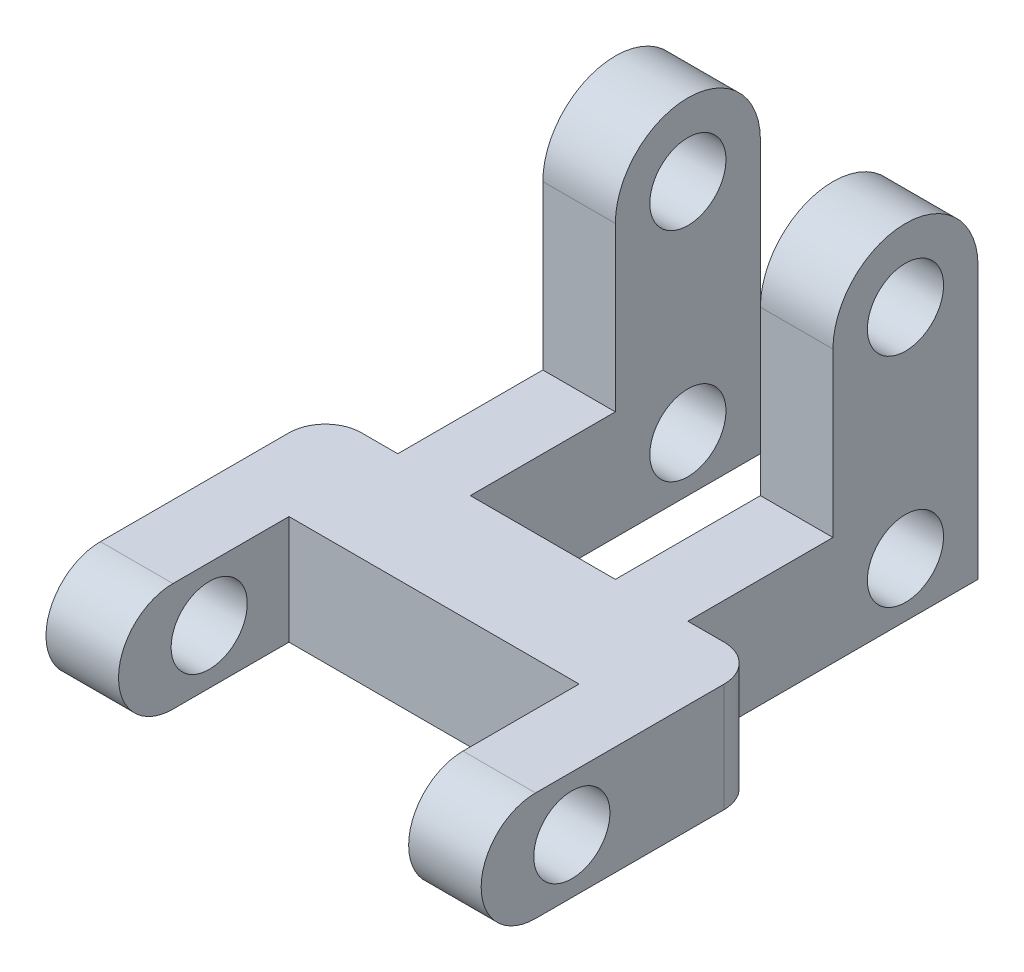
ISO-10303-21;
HEADER;
FILE_DESCRIPTION(('STEP AP214'),'2;1');
FILE_NAME('part.step','',(''),(''),'','','');
FILE_SCHEMA(('AUTOMOTIVE_DESIGN { 1 0 10303 214 1 1 1 1 }'));
ENDSEC;
DATA;
#1=APPLICATION_CONTEXT('core data for automotive mechanical design processes');
#2=APPLICATION_PROTOCOL_DEFINITION('international standard','automotive_design',2000,#1);
#3=PRODUCT_CONTEXT('',#1,'mechanical');
#4=PRODUCT('Part','Part','',(#3));
#5=PRODUCT_RELATED_PRODUCT_CATEGORY('part','',(#4));
#6=PRODUCT_DEFINITION_FORMATION('','',#4);
#7=PRODUCT_DEFINITION_CONTEXT('part definition',#1,'design');
#8=PRODUCT_DEFINITION('design','',#6,#7);
#9=PRODUCT_DEFINITION_SHAPE('','',#8);
#10=(LENGTH_UNIT() NAMED_UNIT(*) SI_UNIT(.MILLI.,.METRE.));
#11=(NAMED_UNIT(*) PLANE_ANGLE_UNIT() SI_UNIT($,.RADIAN.));
#12=(NAMED_UNIT(*) SI_UNIT($,.STERADIAN.) SOLID_ANGLE_UNIT());
#13=UNCERTAINTY_MEASURE_WITH_UNIT(LENGTH_MEASURE(1.E-05),#10,'distance_accuracy_value','');
#14=(GEOMETRIC_REPRESENTATION_CONTEXT(3) GLOBAL_UNCERTAINTY_ASSIGNED_CONTEXT((#13)) GLOBAL_UNIT_ASSIGNED_CONTEXT((#10,
#11,#12)) REPRESENTATION_CONTEXT('',''));
#15=CARTESIAN_POINT('',(0.,0.,0.));
#16=DIRECTION('',(0.,0.,1.));
#17=DIRECTION('',(1.,0.,0.));
#18=AXIS2_PLACEMENT_3D('',#15,#16,#17);
#19=CARTESIAN_POINT('',(-8.,1.49999999999999,-6.));
#20=DIRECTION('',(1.,0.,0.));
#21=DIRECTION('',(0.,1.,0.));
#22=AXIS2_PLACEMENT_3D('',#19,#20,#21);
#23=CYLINDRICAL_SURFACE('',#22,1.05);
#24=CARTESIAN_POINT('',(4.,1.5,-6.));
#25=DIRECTION('',(1.,0.,0.));
#26=DIRECTION('',(0.,1.,0.));
#27=AXIS2_PLACEMENT_3D('',#24,#25,#26);
#28=CIRCLE('',#27,1.05);
#29=CARTESIAN_POINT('',(4.,2.55,-6.));
#30=VERTEX_POINT('',#29);
#31=EDGE_CURVE('E269',#30,#30,#28,.T.);
#32=ORIENTED_EDGE('',*,*,#31,.T.);
#33=EDGE_LOOP('',(#32));
#34=FACE_BOUND('',#33,.T.);
#35=CARTESIAN_POINT('',(2.,1.5,-6.));
#36=DIRECTION('',(1.,0.,0.));
#37=DIRECTION('',(0.,0.,-1.));
#38=AXIS2_PLACEMENT_3D('',#35,#36,#37);
#39=CIRCLE('',#38,1.05);
#40=CARTESIAN_POINT('',(2.,1.5,-7.05));
#41=VERTEX_POINT('',#40);
#42=EDGE_CURVE('E376',#41,#41,#39,.F.);
#43=ORIENTED_EDGE('',*,*,#42,.T.);
#44=EDGE_LOOP('',(#43));
#45=FACE_BOUND('',#44,.T.);
#46=ADVANCED_FACE('F35',(#34,#45),#23,.F.);
#47=CARTESIAN_POINT('',(-6.,3.,0.));
#48=DIRECTION('',(0.,0.,1.));
#49=DIRECTION('',(1.,0.,0.));
#50=AXIS2_PLACEMENT_3D('',#47,#48,#49);
#51=PLANE('',#50);
#52=DIRECTION('',(0.,1.,0.));
#53=VECTOR('',#52,1.);
#54=CARTESIAN_POINT('',(4.,3.,0.));
#55=LINE('',#54,#53);
#56=CARTESIAN_POINT('',(4.,0.,0.));
#57=VERTEX_POINT('',#56);
#58=CARTESIAN_POINT('',(4.,3.,0.));
#59=VERTEX_POINT('',#58);
#60=EDGE_CURVE('E220',#57,#59,#55,.T.);
#61=ORIENTED_EDGE('',*,*,#60,.T.);
#62=DIRECTION('',(-1.,0.,0.));
#63=VECTOR('',#62,1.);
#64=CARTESIAN_POINT('',(-6.,3.,0.));
#65=LINE('',#64,#63);
#66=CARTESIAN_POINT('',(5.,3.,0.));
#67=VERTEX_POINT('',#66);
#68=EDGE_CURVE('E329',#67,#59,#65,.T.);
#69=ORIENTED_EDGE('',*,*,#68,.F.);
#70=DIRECTION('',(0.,-1.,0.));
#71=VECTOR('',#70,1.);
#72=CARTESIAN_POINT('',(5.,3.,0.));
#73=LINE('',#72,#71);
#74=CARTESIAN_POINT('',(5.,0.,0.));
#75=VERTEX_POINT('',#74);
#76=EDGE_CURVE('E359',#67,#75,#73,.T.);
#77=ORIENTED_EDGE('',*,*,#76,.T.);
#78=DIRECTION('',(-1.,0.,0.));
#79=VECTOR('',#78,1.);
#80=CARTESIAN_POINT('',(-6.,0.,0.));
#81=LINE('',#80,#79);
#82=EDGE_CURVE('E345',#75,#57,#81,.T.);
#83=ORIENTED_EDGE('',*,*,#82,.T.);
#84=EDGE_LOOP('',(#61,#69,#77,#83));
#85=FACE_BOUND('',#84,.T.);
#86=ADVANCED_FACE('F404',(#85),#51,.F.);
#87=DIRECTION('',(0.,-1.,0.));
#88=VECTOR('',#87,1.);
#89=CARTESIAN_POINT('',(-4.,0.,0.));
#90=LINE('',#89,#88);
#91=CARTESIAN_POINT('',(-4.,3.,0.));
#92=VERTEX_POINT('',#91);
#93=CARTESIAN_POINT('',(-4.,0.,0.));
#94=VERTEX_POINT('',#93);
#95=EDGE_CURVE('E218',#92,#94,#90,.T.);
#96=ORIENTED_EDGE('',*,*,#95,.T.);
#97=CARTESIAN_POINT('',(-5.,0.,0.));
#98=VERTEX_POINT('',#97);
#99=EDGE_CURVE('E344',#94,#98,#81,.T.);
#100=ORIENTED_EDGE('',*,*,#99,.T.);
#101=DIRECTION('',(0.,-1.,0.));
#102=VECTOR('',#101,1.);
#103=CARTESIAN_POINT('',(-5.,3.,0.));
#104=LINE('',#103,#102);
#105=CARTESIAN_POINT('',(-5.,3.,0.));
#106=VERTEX_POINT('',#105);
#107=EDGE_CURVE('E356',#98,#106,#104,.F.);
#108=ORIENTED_EDGE('',*,*,#107,.T.);
#109=EDGE_CURVE('E328',#92,#106,#65,.T.);
#110=ORIENTED_EDGE('',*,*,#109,.F.);
#111=EDGE_LOOP('',(#96,#100,#108,#110));
#112=FACE_BOUND('',#111,.T.);
#113=ADVANCED_FACE('F410',(#112),#51,.F.);
#114=CARTESIAN_POINT('',(-4.,3.,8.7));
#115=DIRECTION('',(-1.,0.,0.));
#116=DIRECTION('',(0.,0.,1.));
#117=AXIS2_PLACEMENT_3D('',#114,#115,#116);
#118=PLANE('',#117);
#119=CARTESIAN_POINT('',(-4.,1.5,5.2));
#120=DIRECTION('',(-1.,0.,0.));
#121=DIRECTION('',(0.,0.,1.));
#122=AXIS2_PLACEMENT_3D('',#119,#120,#121);
#123=CIRCLE('',#122,1.05);
#124=CARTESIAN_POINT('',(-4.,1.5,6.25));
#125=VERTEX_POINT('',#124);
#126=EDGE_CURVE('E298',#125,#125,#123,.T.);
#127=ORIENTED_EDGE('',*,*,#126,.T.);
#128=EDGE_LOOP('',(#127));
#129=FACE_BOUND('',#128,.T.);
#130=CARTESIAN_POINT('',(-4.,1.5,6.2));
#131=DIRECTION('',(-1.,0.,0.));
#132=DIRECTION('',(0.,0.,1.));
#133=AXIS2_PLACEMENT_3D('',#130,#131,#132);
#134=CIRCLE('',#133,1.5);
#135=CARTESIAN_POINT('',(-4.,0.,6.2));
#136=VERTEX_POINT('',#135);
#137=CARTESIAN_POINT('',(-4.,3.,6.2));
#138=VERTEX_POINT('',#137);
#139=EDGE_CURVE('E314',#136,#138,#134,.T.);
#140=ORIENTED_EDGE('',*,*,#139,.F.);
#141=DIRECTION('',(0.,0.,-1.));
#142=VECTOR('',#141,1.);
#143=CARTESIAN_POINT('',(-4.,0.,8.7));
#144=LINE('',#143,#142);
#145=CARTESIAN_POINT('',(-4.,0.,3.));
#146=VERTEX_POINT('',#145);
#147=EDGE_CURVE('E316',#136,#146,#144,.T.);
#148=ORIENTED_EDGE('',*,*,#147,.T.);
#149=DIRECTION('',(0.,-1.,0.));
#150=VECTOR('',#149,1.);
#151=CARTESIAN_POINT('',(-4.,3.,3.));
#152=LINE('',#151,#150);
#153=CARTESIAN_POINT('',(-4.,3.,3.));
#154=VERTEX_POINT('',#153);
#155=EDGE_CURVE('E350',#154,#146,#152,.T.);
#156=ORIENTED_EDGE('',*,*,#155,.F.);
#157=DIRECTION('',(0.,0.,-1.));
#158=VECTOR('',#157,1.);
#159=CARTESIAN_POINT('',(-4.,3.,8.7));
#160=LINE('',#159,#158);
#161=EDGE_CURVE('E317',#138,#154,#160,.T.);
#162=ORIENTED_EDGE('',*,*,#161,.F.);
#163=EDGE_LOOP('',(#140,#148,#156,#162));
#164=FACE_BOUND('',#163,.T.);
#165=ADVANCED_FACE('F495',(#129,#164),#118,.F.);
#166=CARTESIAN_POINT('',(4.,3.,3.));
#167=DIRECTION('',(1.,0.,0.));
#168=DIRECTION('',(0.,0.,-1.));
#169=AXIS2_PLACEMENT_3D('',#166,#167,#168);
#170=PLANE('',#169);
#171=CARTESIAN_POINT('',(4.,1.5,5.2));
#172=DIRECTION('',(1.,0.,0.));
#173=DIRECTION('',(0.,0.,-1.));
#174=AXIS2_PLACEMENT_3D('',#171,#172,#173);
#175=CIRCLE('',#174,1.05);
#176=CARTESIAN_POINT('',(4.,1.5,4.15));
#177=VERTEX_POINT('',#176);
#178=EDGE_CURVE('E293',#177,#177,#175,.T.);
#179=ORIENTED_EDGE('',*,*,#178,.T.);
#180=EDGE_LOOP('',(#179));
#181=FACE_BOUND('',#180,.T.);
#182=CARTESIAN_POINT('',(4.,1.5,6.2));
#183=DIRECTION('',(1.,0.,0.));
#184=DIRECTION('',(0.,0.,-1.));
#185=AXIS2_PLACEMENT_3D('',#182,#183,#184);
#186=CIRCLE('',#185,1.5);
#187=CARTESIAN_POINT('',(4.,3.,6.2));
#188=VERTEX_POINT('',#187);
#189=CARTESIAN_POINT('',(4.,0.,6.2));
#190=VERTEX_POINT('',#189);
#191=EDGE_CURVE('E310',#188,#190,#186,.T.);
#192=ORIENTED_EDGE('',*,*,#191,.F.);
#193=DIRECTION('',(0.,0.,1.));
#194=VECTOR('',#193,1.);
#195=CARTESIAN_POINT('',(4.,3.,3.));
#196=LINE('',#195,#194);
#197=CARTESIAN_POINT('',(4.,3.,3.));
#198=VERTEX_POINT('',#197);
#199=EDGE_CURVE('E322',#198,#188,#196,.T.);
#200=ORIENTED_EDGE('',*,*,#199,.F.);
#201=DIRECTION('',(0.,-1.,0.));
#202=VECTOR('',#201,1.);
#203=CARTESIAN_POINT('',(4.,3.,3.));
#204=LINE('',#203,#202);
#205=CARTESIAN_POINT('',(4.,0.,3.));
#206=VERTEX_POINT('',#205);
#207=EDGE_CURVE('E334',#198,#206,#204,.T.);
#208=ORIENTED_EDGE('',*,*,#207,.T.);
#209=DIRECTION('',(0.,0.,1.));
#210=VECTOR('',#209,1.);
#211=CARTESIAN_POINT('',(4.,0.,3.));
#212=LINE('',#211,#210);
#213=EDGE_CURVE('E338',#206,#190,#212,.T.);
#214=ORIENTED_EDGE('',*,*,#213,.T.);
#215=EDGE_LOOP('',(#192,#200,#208,#214));
#216=FACE_BOUND('',#215,.T.);
#217=ADVANCED_FACE('F504',(#181,#216),#170,.F.);
#218=CARTESIAN_POINT('',(6.,3.,8.7));
#219=DIRECTION('',(-1.,0.,0.));
#220=DIRECTION('',(0.,0.,1.));
#221=AXIS2_PLACEMENT_3D('',#218,#219,#220);
#222=PLANE('',#221);
#223=CARTESIAN_POINT('',(6.,1.5,5.2));
#224=DIRECTION('',(-1.,0.,0.));
#225=DIRECTION('',(0.,0.,1.));
#226=AXIS2_PLACEMENT_3D('',#223,#224,#225);
#227=CIRCLE('',#226,1.05);
#228=CARTESIAN_POINT('',(6.,1.5,6.25));
#229=VERTEX_POINT('',#228);
#230=EDGE_CURVE('E290',#229,#229,#227,.T.);
#231=ORIENTED_EDGE('',*,*,#230,.T.);
#232=EDGE_LOOP('',(#231));
#233=FACE_BOUND('',#232,.T.);
#234=DIRECTION('',(0.,0.,-1.));
#235=VECTOR('',#234,1.);
#236=CARTESIAN_POINT('',(6.,0.,8.7));
#237=LINE('',#236,#235);
#238=CARTESIAN_POINT('',(6.00000000000001,0.,6.2));
#239=VERTEX_POINT('',#238);
#240=CARTESIAN_POINT('',(6.,0.,1.));
#241=VERTEX_POINT('',#240);
#242=EDGE_CURVE('E341',#239,#241,#237,.T.);
#243=ORIENTED_EDGE('',*,*,#242,.T.);
#244=DIRECTION('',(0.,-1.,0.));
#245=VECTOR('',#244,1.);
#246=CARTESIAN_POINT('',(6.,3.,1.));
#247=LINE('',#246,#245);
#248=CARTESIAN_POINT('',(6.,3.,1.));
#249=VERTEX_POINT('',#248);
#250=EDGE_CURVE('E367',#241,#249,#247,.F.);
#251=ORIENTED_EDGE('',*,*,#250,.T.);
#252=DIRECTION('',(0.,0.,-1.));
#253=VECTOR('',#252,1.);
#254=CARTESIAN_POINT('',(6.,3.,8.7));
#255=LINE('',#254,#253);
#256=CARTESIAN_POINT('',(6.00000000000001,3.,6.2));
#257=VERTEX_POINT('',#256);
#258=EDGE_CURVE('E325',#257,#249,#255,.T.);
#259=ORIENTED_EDGE('',*,*,#258,.F.);
#260=CARTESIAN_POINT('',(6.00000000000001,1.5,6.2));
#261=DIRECTION('',(-1.,0.,0.));
#262=DIRECTION('',(0.,0.,1.));
#263=AXIS2_PLACEMENT_3D('',#260,#261,#262);
#264=CIRCLE('',#263,1.5);
#265=EDGE_CURVE('E302',#239,#257,#264,.T.);
#266=ORIENTED_EDGE('',*,*,#265,.F.);
#267=EDGE_LOOP('',(#243,#251,#259,#266));
#268=FACE_BOUND('',#267,.T.);
#269=ADVANCED_FACE('F511',(#233,#268),#222,.F.);
#270=CARTESIAN_POINT('',(-6.,3.,0.));
#271=DIRECTION('',(1.,0.,0.));
#272=DIRECTION('',(0.,0.,-1.));
#273=AXIS2_PLACEMENT_3D('',#270,#271,#272);
#274=PLANE('',#273);
#275=CARTESIAN_POINT('',(-6.,1.5,5.2));
#276=DIRECTION('',(-1.,0.,0.));
#277=DIRECTION('',(0.,0.,1.));
#278=AXIS2_PLACEMENT_3D('',#275,#276,#277);
#279=CIRCLE('',#278,1.05);
#280=CARTESIAN_POINT('',(-6.,1.5,6.25));
#281=VERTEX_POINT('',#280);
#282=EDGE_CURVE('E289',#281,#281,#279,.T.);
#283=ORIENTED_EDGE('',*,*,#282,.F.);
#284=EDGE_LOOP('',(#283));
#285=FACE_BOUND('',#284,.T.);
#286=DIRECTION('',(0.,0.,1.));
#287=VECTOR('',#286,1.);
#288=CARTESIAN_POINT('',(-6.,3.,0.));
#289=LINE('',#288,#287);
#290=CARTESIAN_POINT('',(-6.,3.,1.));
#291=VERTEX_POINT('',#290);
#292=CARTESIAN_POINT('',(-6.,3.,6.2));
#293=VERTEX_POINT('',#292);
#294=EDGE_CURVE('E332',#291,#293,#289,.T.);
#295=ORIENTED_EDGE('',*,*,#294,.F.);
#296=DIRECTION('',(0.,-1.,0.));
#297=VECTOR('',#296,1.);
#298=CARTESIAN_POINT('',(-6.,3.,1.));
#299=LINE('',#298,#297);
#300=CARTESIAN_POINT('',(-6.,0.,1.));
#301=VERTEX_POINT('',#300);
#302=EDGE_CURVE('E373',#291,#301,#299,.T.);
#303=ORIENTED_EDGE('',*,*,#302,.T.);
#304=DIRECTION('',(0.,0.,1.));
#305=VECTOR('',#304,1.);
#306=CARTESIAN_POINT('',(-6.,0.,0.));
#307=LINE('',#306,#305);
#308=CARTESIAN_POINT('',(-6.,0.,6.2));
#309=VERTEX_POINT('',#308);
#310=EDGE_CURVE('E320',#301,#309,#307,.T.);
#311=ORIENTED_EDGE('',*,*,#310,.T.);
#312=CARTESIAN_POINT('',(-6.,1.5,6.2));
#313=DIRECTION('',(-1.,0.,0.));
#314=DIRECTION('',(0.,0.,1.));
#315=AXIS2_PLACEMENT_3D('',#312,#313,#314);
#316=CIRCLE('',#315,1.5);
#317=EDGE_CURVE('E301',#309,#293,#316,.T.);
#318=ORIENTED_EDGE('',*,*,#317,.T.);
#319=EDGE_LOOP('',(#295,#303,#311,#318));
#320=FACE_BOUND('',#319,.T.);
#321=ADVANCED_FACE('F485',(#285,#320),#274,.F.);
#322=CARTESIAN_POINT('',(0.,3.,0.));
#323=DIRECTION('',(0.,-1.,0.));
#324=DIRECTION('',(0.,0.,-1.));
#325=AXIS2_PLACEMENT_3D('',#322,#323,#324);
#326=PLANE('',#325);
#327=DIRECTION('',(1.,0.,0.));
#328=VECTOR('',#327,1.);
#329=CARTESIAN_POINT('',(2.,3.,-4.));
#330=LINE('',#329,#328);
#331=CARTESIAN_POINT('',(2.,3.,-4.));
#332=VERTEX_POINT('',#331);
#333=CARTESIAN_POINT('',(4.,3.,-4.));
#334=VERTEX_POINT('',#333);
#335=EDGE_CURVE('E235',#332,#334,#330,.T.);
#336=ORIENTED_EDGE('',*,*,#335,.F.);
#337=DIRECTION('',(0.,0.,-1.));
#338=VECTOR('',#337,1.);
#339=CARTESIAN_POINT('',(2.,3.,-6.));
#340=LINE('',#339,#338);
#341=CARTESIAN_POINT('',(2.,3.,0.));
#342=VERTEX_POINT('',#341);
#343=EDGE_CURVE('E199',#342,#332,#340,.T.);
#344=ORIENTED_EDGE('',*,*,#343,.F.);
#345=DIRECTION('',(1.,0.,0.));
#346=VECTOR('',#345,1.);
#347=CARTESIAN_POINT('',(-2.,3.,0.));
#348=LINE('',#347,#346);
#349=CARTESIAN_POINT('',(-2.,3.,0.));
#350=VERTEX_POINT('',#349);
#351=EDGE_CURVE('E194',#350,#342,#348,.T.);
#352=ORIENTED_EDGE('',*,*,#351,.F.);
#353=DIRECTION('',(0.,0.,1.));
#354=VECTOR('',#353,1.);
#355=CARTESIAN_POINT('',(-2.,3.,-6.));
#356=LINE('',#355,#354);
#357=CARTESIAN_POINT('',(-2.,3.,-4.));
#358=VERTEX_POINT('',#357);
#359=EDGE_CURVE('E202',#358,#350,#356,.T.);
#360=ORIENTED_EDGE('',*,*,#359,.F.);
#361=DIRECTION('',(-1.,0.,0.));
#362=VECTOR('',#361,1.);
#363=CARTESIAN_POINT('',(-2.,3.,-4.));
#364=LINE('',#363,#362);
#365=CARTESIAN_POINT('',(-4.,3.,-4.));
#366=VERTEX_POINT('',#365);
#367=EDGE_CURVE('E249',#358,#366,#364,.T.);
#368=ORIENTED_EDGE('',*,*,#367,.T.);
#369=DIRECTION('',(0.,0.,1.));
#370=VECTOR('',#369,1.);
#371=CARTESIAN_POINT('',(-4.,3.,-8.));
#372=LINE('',#371,#370);
#373=EDGE_CURVE('E286',#366,#92,#372,.T.);
#374=ORIENTED_EDGE('',*,*,#373,.T.);
#375=ORIENTED_EDGE('',*,*,#109,.T.);
#376=CARTESIAN_POINT('',(-5.,3.,1.));
#377=DIRECTION('',(0.,-1.,0.));
#378=DIRECTION('',(0.,0.,-1.));
#379=AXIS2_PLACEMENT_3D('',#376,#377,#378);
#380=CIRCLE('',#379,1.);
#381=EDGE_CURVE('E369',#106,#291,#380,.F.);
#382=ORIENTED_EDGE('',*,*,#381,.T.);
#383=ORIENTED_EDGE('',*,*,#294,.T.);
#384=DIRECTION('',(-1.,0.,0.));
#385=VECTOR('',#384,1.);
#386=CARTESIAN_POINT('',(6.00000000000001,3.,6.2));
#387=LINE('',#386,#385);
#388=EDGE_CURVE('E304',#138,#293,#387,.T.);
#389=ORIENTED_EDGE('',*,*,#388,.F.);
#390=ORIENTED_EDGE('',*,*,#161,.T.);
#391=DIRECTION('',(1.,0.,0.));
#392=VECTOR('',#391,1.);
#393=CARTESIAN_POINT('',(-4.,3.,3.));
#394=LINE('',#393,#392);
#395=EDGE_CURVE('E319',#154,#198,#394,.T.);
#396=ORIENTED_EDGE('',*,*,#395,.T.);
#397=ORIENTED_EDGE('',*,*,#199,.T.);
#398=EDGE_CURVE('E311',#257,#188,#387,.T.);
#399=ORIENTED_EDGE('',*,*,#398,.F.);
#400=ORIENTED_EDGE('',*,*,#258,.T.);
#401=CARTESIAN_POINT('',(5.,3.,1.));
#402=DIRECTION('',(0.,-1.,0.));
#403=DIRECTION('',(0.,0.,-1.));
#404=AXIS2_PLACEMENT_3D('',#401,#402,#403);
#405=CIRCLE('',#404,1.);
#406=EDGE_CURVE('E371',#249,#67,#405,.F.);
#407=ORIENTED_EDGE('',*,*,#406,.T.);
#408=ORIENTED_EDGE('',*,*,#68,.T.);
#409=DIRECTION('',(0.,0.,1.));
#410=VECTOR('',#409,1.);
#411=CARTESIAN_POINT('',(4.,3.,-8.));
#412=LINE('',#411,#410);
#413=EDGE_CURVE('E284',#334,#59,#412,.T.);
#414=ORIENTED_EDGE('',*,*,#413,.F.);
#415=EDGE_LOOP('',(#336,#344,#352,#360,#368,#374,#375,#382,#383,#389,#390,#396,#397,#399,#400,
#407,#408,#414));
#416=FACE_BOUND('',#415,.T.);
#417=ADVANCED_FACE('F213',(#416),#326,.F.);
#418=CARTESIAN_POINT('',(0.,0.,0.));
#419=DIRECTION('',(0.,-1.,0.));
#420=DIRECTION('',(0.,0.,-1.));
#421=AXIS2_PLACEMENT_3D('',#418,#419,#420);
#422=PLANE('',#421);
#423=DIRECTION('',(-1.,0.,0.));
#424=VECTOR('',#423,1.);
#425=CARTESIAN_POINT('',(0.,0.,0.));
#426=LINE('',#425,#424);
#427=CARTESIAN_POINT('',(2.,0.,0.));
#428=VERTEX_POINT('',#427);
#429=CARTESIAN_POINT('',(-2.,0.,0.));
#430=VERTEX_POINT('',#429);
#431=EDGE_CURVE('E12',#428,#430,#426,.T.);
#432=ORIENTED_EDGE('',*,*,#431,.F.);
#433=DIRECTION('',(0.,0.,-1.));
#434=VECTOR('',#433,1.);
#435=CARTESIAN_POINT('',(2.,0.,-8.));
#436=LINE('',#435,#434);
#437=CARTESIAN_POINT('',(2.,0.,-8.));
#438=VERTEX_POINT('',#437);
#439=EDGE_CURVE('E263',#428,#438,#436,.T.);
#440=ORIENTED_EDGE('',*,*,#439,.T.);
#441=DIRECTION('',(-1.,0.,0.));
#442=VECTOR('',#441,1.);
#443=CARTESIAN_POINT('',(-4.,0.,-8.));
#444=LINE('',#443,#442);
#445=CARTESIAN_POINT('',(4.,0.,-8.));
#446=VERTEX_POINT('',#445);
#447=EDGE_CURVE('E276',#446,#438,#444,.T.);
#448=ORIENTED_EDGE('',*,*,#447,.F.);
#449=DIRECTION('',(0.,0.,1.));
#450=VECTOR('',#449,1.);
#451=CARTESIAN_POINT('',(4.,0.,-8.));
#452=LINE('',#451,#450);
#453=EDGE_CURVE('E59',#446,#57,#452,.T.);
#454=ORIENTED_EDGE('',*,*,#453,.T.);
#455=ORIENTED_EDGE('',*,*,#82,.F.);
#456=CARTESIAN_POINT('',(5.,0.,1.));
#457=DIRECTION('',(0.,-1.,0.));
#458=DIRECTION('',(0.,0.,-1.));
#459=AXIS2_PLACEMENT_3D('',#456,#457,#458);
#460=CIRCLE('',#459,1.);
#461=EDGE_CURVE('E365',#75,#241,#460,.T.);
#462=ORIENTED_EDGE('',*,*,#461,.T.);
#463=ORIENTED_EDGE('',*,*,#242,.F.);
#464=DIRECTION('',(-1.,0.,0.));
#465=VECTOR('',#464,1.);
#466=CARTESIAN_POINT('',(6.00000000000001,0.,6.2));
#467=LINE('',#466,#465);
#468=EDGE_CURVE('E307',#239,#190,#467,.T.);
#469=ORIENTED_EDGE('',*,*,#468,.T.);
#470=ORIENTED_EDGE('',*,*,#213,.F.);
#471=DIRECTION('',(1.,0.,0.));
#472=VECTOR('',#471,1.);
#473=CARTESIAN_POINT('',(-4.,0.,3.));
#474=LINE('',#473,#472);
#475=EDGE_CURVE('E336',#146,#206,#474,.T.);
#476=ORIENTED_EDGE('',*,*,#475,.F.);
#477=ORIENTED_EDGE('',*,*,#147,.F.);
#478=DIRECTION('',(-1.,0.,0.));
#479=VECTOR('',#478,1.);
#480=CARTESIAN_POINT('',(6.00000000000001,0.,6.2));
#481=LINE('',#480,#479);
#482=EDGE_CURVE('E353',#136,#309,#481,.T.);
#483=ORIENTED_EDGE('',*,*,#482,.T.);
#484=ORIENTED_EDGE('',*,*,#310,.F.);
#485=CARTESIAN_POINT('',(-5.,0.,1.));
#486=DIRECTION('',(0.,-1.,0.));
#487=DIRECTION('',(0.,0.,-1.));
#488=AXIS2_PLACEMENT_3D('',#485,#486,#487);
#489=CIRCLE('',#488,1.);
#490=EDGE_CURVE('E362',#301,#98,#489,.T.);
#491=ORIENTED_EDGE('',*,*,#490,.T.);
#492=ORIENTED_EDGE('',*,*,#99,.F.);
#493=DIRECTION('',(0.,0.,1.));
#494=VECTOR('',#493,1.);
#495=CARTESIAN_POINT('',(-4.,0.,-8.));
#496=LINE('',#495,#494);
#497=CARTESIAN_POINT('',(-4.,0.,-8.));
#498=VERTEX_POINT('',#497);
#499=EDGE_CURVE('E51',#498,#94,#496,.T.);
#500=ORIENTED_EDGE('',*,*,#499,.F.);
#501=CARTESIAN_POINT('',(-2.,0.,-8.));
#502=VERTEX_POINT('',#501);
#503=EDGE_CURVE('E275',#502,#498,#444,.T.);
#504=ORIENTED_EDGE('',*,*,#503,.F.);
#505=DIRECTION('',(0.,0.,1.));
#506=VECTOR('',#505,1.);
#507=CARTESIAN_POINT('',(-2.,0.,-8.));
#508=LINE('',#507,#506);
#509=EDGE_CURVE('E267',#502,#430,#508,.T.);
#510=ORIENTED_EDGE('',*,*,#509,.T.);
#511=EDGE_LOOP('',(#432,#440,#448,#454,#455,#462,#463,#469,#470,#476,#477,#483,#484,#491,#492,
#500,#504,#510));
#512=FACE_BOUND('',#511,.T.);
#513=ADVANCED_FACE('F466',(#512),#422,.T.);
#514=CARTESIAN_POINT('',(-4.,3.,3.));
#515=DIRECTION('',(0.,0.,-1.));
#516=DIRECTION('',(-1.,0.,0.));
#517=AXIS2_PLACEMENT_3D('',#514,#515,#516);
#518=PLANE('',#517);
#519=ORIENTED_EDGE('',*,*,#475,.T.);
#520=ORIENTED_EDGE('',*,*,#207,.F.);
#521=ORIENTED_EDGE('',*,*,#395,.F.);
#522=ORIENTED_EDGE('',*,*,#155,.T.);
#523=EDGE_LOOP('',(#519,#520,#521,#522));
#524=FACE_BOUND('',#523,.T.);
#525=ADVANCED_FACE('F500',(#524),#518,.F.);
#526=CARTESIAN_POINT('',(6.00000000000001,1.5,6.2));
#527=DIRECTION('',(-1.,0.,0.));
#528=DIRECTION('',(0.,0.,1.));
#529=AXIS2_PLACEMENT_3D('',#526,#527,#528);
#530=CYLINDRICAL_SURFACE('',#529,1.5);
#531=ORIENTED_EDGE('',*,*,#139,.T.);
#532=ORIENTED_EDGE('',*,*,#388,.T.);
#533=ORIENTED_EDGE('',*,*,#317,.F.);
#534=ORIENTED_EDGE('',*,*,#482,.F.);
#535=EDGE_LOOP('',(#531,#532,#533,#534));
#536=FACE_BOUND('',#535,.T.);
#537=ADVANCED_FACE('F488',(#536),#530,.T.);
#538=ORIENTED_EDGE('',*,*,#191,.T.);
#539=ORIENTED_EDGE('',*,*,#468,.F.);
#540=ORIENTED_EDGE('',*,*,#265,.T.);
#541=ORIENTED_EDGE('',*,*,#398,.T.);
#542=EDGE_LOOP('',(#538,#539,#540,#541));
#543=FACE_BOUND('',#542,.T.);
#544=ADVANCED_FACE('F535',(#543),#530,.T.);
#545=CARTESIAN_POINT('',(6.,1.5,5.2));
#546=DIRECTION('',(-1.,0.,0.));
#547=DIRECTION('',(0.,0.,1.));
#548=AXIS2_PLACEMENT_3D('',#545,#546,#547);
#549=CYLINDRICAL_SURFACE('',#548,1.05);
#550=ORIENTED_EDGE('',*,*,#282,.T.);
#551=EDGE_LOOP('',(#550));
#552=FACE_BOUND('',#551,.T.);
#553=ORIENTED_EDGE('',*,*,#126,.F.);
#554=EDGE_LOOP('',(#553));
#555=FACE_BOUND('',#554,.T.);
#556=ADVANCED_FACE('F531',(#552,#555),#549,.F.);
#557=ORIENTED_EDGE('',*,*,#230,.F.);
#558=EDGE_LOOP('',(#557));
#559=FACE_BOUND('',#558,.T.);
#560=ORIENTED_EDGE('',*,*,#178,.F.);
#561=EDGE_LOOP('',(#560));
#562=FACE_BOUND('',#561,.T.);
#563=ADVANCED_FACE('F534',(#559,#562),#549,.F.);
#564=CARTESIAN_POINT('',(5.,3.,1.));
#565=DIRECTION('',(0.,-1.,0.));
#566=DIRECTION('',(0.,0.,-1.));
#567=AXIS2_PLACEMENT_3D('',#564,#565,#566);
#568=CYLINDRICAL_SURFACE('',#567,1.);
#569=ORIENTED_EDGE('',*,*,#406,.F.);
#570=ORIENTED_EDGE('',*,*,#250,.F.);
#571=ORIENTED_EDGE('',*,*,#461,.F.);
#572=ORIENTED_EDGE('',*,*,#76,.F.);
#573=EDGE_LOOP('',(#569,#570,#571,#572));
#574=FACE_BOUND('',#573,.T.);
#575=ADVANCED_FACE('F515',(#574),#568,.T.);
#576=CARTESIAN_POINT('',(-5.,3.,1.));
#577=DIRECTION('',(0.,-1.,0.));
#578=DIRECTION('',(0.,0.,-1.));
#579=AXIS2_PLACEMENT_3D('',#576,#577,#578);
#580=CYLINDRICAL_SURFACE('',#579,1.);
#581=ORIENTED_EDGE('',*,*,#381,.F.);
#582=ORIENTED_EDGE('',*,*,#107,.F.);
#583=ORIENTED_EDGE('',*,*,#490,.F.);
#584=ORIENTED_EDGE('',*,*,#302,.F.);
#585=EDGE_LOOP('',(#581,#582,#583,#584));
#586=FACE_BOUND('',#585,.T.);
#587=ADVANCED_FACE('F37',(#586),#580,.T.);
#588=CARTESIAN_POINT('',(2.,7.5,-6.));
#589=DIRECTION('',(1.,0.,0.));
#590=DIRECTION('',(0.,0.,-1.));
#591=AXIS2_PLACEMENT_3D('',#588,#589,#590);
#592=CYLINDRICAL_SURFACE('',#591,2.);
#593=CARTESIAN_POINT('',(4.,7.5,-6.));
#594=DIRECTION('',(-1.,0.,0.));
#595=DIRECTION('',(0.,0.,1.));
#596=AXIS2_PLACEMENT_3D('',#593,#594,#595);
#597=CIRCLE('',#596,2.);
#598=CARTESIAN_POINT('',(4.,7.5,-4.));
#599=VERTEX_POINT('',#598);
#600=CARTESIAN_POINT('',(4.,7.5,-8.));
#601=VERTEX_POINT('',#600);
#602=EDGE_CURVE('E223',#599,#601,#597,.T.);
#603=ORIENTED_EDGE('',*,*,#602,.T.);
#604=DIRECTION('',(1.,0.,0.));
#605=VECTOR('',#604,1.);
#606=CARTESIAN_POINT('',(2.,7.5,-8.));
#607=LINE('',#606,#605);
#608=CARTESIAN_POINT('',(2.,7.5,-8.));
#609=VERTEX_POINT('',#608);
#610=EDGE_CURVE('E231',#609,#601,#607,.T.);
#611=ORIENTED_EDGE('',*,*,#610,.F.);
#612=CARTESIAN_POINT('',(2.,7.5,-6.));
#613=DIRECTION('',(-1.,0.,0.));
#614=DIRECTION('',(0.,0.,1.));
#615=AXIS2_PLACEMENT_3D('',#612,#613,#614);
#616=CIRCLE('',#615,2.);
#617=CARTESIAN_POINT('',(2.,7.5,-4.));
#618=VERTEX_POINT('',#617);
#619=EDGE_CURVE('E225',#618,#609,#616,.T.);
#620=ORIENTED_EDGE('',*,*,#619,.F.);
#621=DIRECTION('',(1.,0.,0.));
#622=VECTOR('',#621,1.);
#623=CARTESIAN_POINT('',(2.,7.5,-4.));
#624=LINE('',#623,#622);
#625=EDGE_CURVE('E239',#618,#599,#624,.T.);
#626=ORIENTED_EDGE('',*,*,#625,.T.);
#627=EDGE_LOOP('',(#603,#611,#620,#626));
#628=FACE_BOUND('',#627,.T.);
#629=ADVANCED_FACE('F397',(#628),#592,.T.);
#630=CARTESIAN_POINT('',(0.,0.,-8.));
#631=DIRECTION('',(0.,0.,1.));
#632=DIRECTION('',(1.,0.,0.));
#633=AXIS2_PLACEMENT_3D('',#630,#631,#632);
#634=PLANE('',#633);
#635=ORIENTED_EDGE('',*,*,#447,.T.);
#636=DIRECTION('',(0.,1.,0.));
#637=VECTOR('',#636,1.);
#638=CARTESIAN_POINT('',(2.,-5.,-8.));
#639=LINE('',#638,#637);
#640=EDGE_CURVE('E257',#438,#609,#639,.T.);
#641=ORIENTED_EDGE('',*,*,#640,.T.);
#642=ORIENTED_EDGE('',*,*,#610,.T.);
#643=DIRECTION('',(0.,-1.,0.));
#644=VECTOR('',#643,1.);
#645=CARTESIAN_POINT('',(4.,0.,-8.));
#646=LINE('',#645,#644);
#647=EDGE_CURVE('E281',#601,#446,#646,.T.);
#648=ORIENTED_EDGE('',*,*,#647,.T.);
#649=EDGE_LOOP('',(#635,#641,#642,#648));
#650=FACE_BOUND('',#649,.T.);
#651=ADVANCED_FACE('F387',(#650),#634,.F.);
#652=CARTESIAN_POINT('',(-2.,-5.,-8.));
#653=DIRECTION('',(-1.,0.,0.));
#654=DIRECTION('',(0.,0.,1.));
#655=AXIS2_PLACEMENT_3D('',#652,#653,#654);
#656=PLANE('',#655);
#657=CARTESIAN_POINT('',(-2.,7.5,-6.));
#658=DIRECTION('',(-1.,0.,0.));
#659=DIRECTION('',(0.,0.,1.));
#660=AXIS2_PLACEMENT_3D('',#657,#658,#659);
#661=CIRCLE('',#660,1.05);
#662=CARTESIAN_POINT('',(-2.,7.5,-4.95));
#663=VERTEX_POINT('',#662);
#664=EDGE_CURVE('E210',#663,#663,#661,.T.);
#665=ORIENTED_EDGE('',*,*,#664,.T.);
#666=EDGE_LOOP('',(#665));
#667=FACE_BOUND('',#666,.T.);
#668=CARTESIAN_POINT('',(-2.,1.5,-6.));
#669=DIRECTION('',(-1.,0.,0.));
#670=DIRECTION('',(0.,0.,1.));
#671=AXIS2_PLACEMENT_3D('',#668,#669,#670);
#672=CIRCLE('',#671,1.05);
#673=CARTESIAN_POINT('',(-2.,1.5,-4.95));
#674=VERTEX_POINT('',#673);
#675=EDGE_CURVE('E44',#674,#674,#672,.F.);
#676=ORIENTED_EDGE('',*,*,#675,.F.);
#677=EDGE_LOOP('',(#676));
#678=FACE_BOUND('',#677,.T.);
#679=DIRECTION('',(0.,1.,0.));
#680=VECTOR('',#679,1.);
#681=CARTESIAN_POINT('',(-2.,3.,-4.));
#682=LINE('',#681,#680);
#683=CARTESIAN_POINT('',(-2.,7.5,-4.));
#684=VERTEX_POINT('',#683);
#685=EDGE_CURVE('E206',#358,#684,#682,.T.);
#686=ORIENTED_EDGE('',*,*,#685,.F.);
#687=ORIENTED_EDGE('',*,*,#359,.T.);
#688=DIRECTION('',(0.,1.,0.));
#689=VECTOR('',#688,1.);
#690=CARTESIAN_POINT('',(-2.,-7.,0.));
#691=LINE('',#690,#689);
#692=EDGE_CURVE('E189',#430,#350,#691,.T.);
#693=ORIENTED_EDGE('',*,*,#692,.F.);
#694=ORIENTED_EDGE('',*,*,#509,.F.);
#695=DIRECTION('',(0.,1.,0.));
#696=VECTOR('',#695,1.);
#697=CARTESIAN_POINT('',(-2.,-5.,-8.));
#698=LINE('',#697,#696);
#699=CARTESIAN_POINT('',(-2.,7.5,-8.));
#700=VERTEX_POINT('',#699);
#701=EDGE_CURVE('E261',#502,#700,#698,.T.);
#702=ORIENTED_EDGE('',*,*,#701,.T.);
#703=CARTESIAN_POINT('',(-2.,7.5,-6.));
#704=DIRECTION('',(-1.,0.,0.));
#705=DIRECTION('',(0.,0.,1.));
#706=AXIS2_PLACEMENT_3D('',#703,#704,#705);
#707=CIRCLE('',#706,2.);
#708=EDGE_CURVE('E245',#684,#700,#707,.T.);
#709=ORIENTED_EDGE('',*,*,#708,.F.);
#710=EDGE_LOOP('',(#686,#687,#693,#694,#702,#709));
#711=FACE_BOUND('',#710,.T.);
#712=ADVANCED_FACE('F203',(#667,#678,#711),#656,.F.);
#713=CARTESIAN_POINT('',(2.,-5.,-8.));
#714=DIRECTION('',(1.,0.,0.));
#715=DIRECTION('',(0.,0.,-1.));
#716=AXIS2_PLACEMENT_3D('',#713,#714,#715);
#717=PLANE('',#716);
#718=CARTESIAN_POINT('',(2.,7.5,-6.));
#719=DIRECTION('',(1.,0.,0.));
#720=DIRECTION('',(0.,0.,-1.));
#721=AXIS2_PLACEMENT_3D('',#718,#719,#720);
#722=CIRCLE('',#721,1.05);
#723=CARTESIAN_POINT('',(2.,7.5,-7.05));
#724=VERTEX_POINT('',#723);
#725=EDGE_CURVE('E453',#724,#724,#722,.T.);
#726=ORIENTED_EDGE('',*,*,#725,.T.);
#727=EDGE_LOOP('',(#726));
#728=FACE_BOUND('',#727,.T.);
#729=ORIENTED_EDGE('',*,*,#42,.F.);
#730=EDGE_LOOP('',(#729));
#731=FACE_BOUND('',#730,.T.);
#732=ORIENTED_EDGE('',*,*,#439,.F.);
#733=DIRECTION('',(0.,1.,0.));
#734=VECTOR('',#733,1.);
#735=CARTESIAN_POINT('',(2.,-7.,0.));
#736=LINE('',#735,#734);
#737=EDGE_CURVE('E198',#428,#342,#736,.T.);
#738=ORIENTED_EDGE('',*,*,#737,.T.);
#739=ORIENTED_EDGE('',*,*,#343,.T.);
#740=DIRECTION('',(0.,1.,0.));
#741=VECTOR('',#740,1.);
#742=CARTESIAN_POINT('',(2.,3.,-4.));
#743=LINE('',#742,#741);
#744=EDGE_CURVE('E228',#332,#618,#743,.T.);
#745=ORIENTED_EDGE('',*,*,#744,.T.);
#746=ORIENTED_EDGE('',*,*,#619,.T.);
#747=ORIENTED_EDGE('',*,*,#640,.F.);
#748=EDGE_LOOP('',(#732,#738,#739,#745,#746,#747));
#749=FACE_BOUND('',#748,.T.);
#750=ADVANCED_FACE('F386',(#728,#731,#749),#717,.F.);
#751=CARTESIAN_POINT('',(2.,3.,-4.));
#752=DIRECTION('',(0.,0.,-1.));
#753=DIRECTION('',(-1.,0.,0.));
#754=AXIS2_PLACEMENT_3D('',#751,#752,#753);
#755=PLANE('',#754);
#756=DIRECTION('',(0.,1.,0.));
#757=VECTOR('',#756,1.);
#758=CARTESIAN_POINT('',(4.,3.,-4.));
#759=LINE('',#758,#757);
#760=EDGE_CURVE('E229',#334,#599,#759,.T.);
#761=ORIENTED_EDGE('',*,*,#760,.T.);
#762=ORIENTED_EDGE('',*,*,#625,.F.);
#763=ORIENTED_EDGE('',*,*,#744,.F.);
#764=ORIENTED_EDGE('',*,*,#335,.T.);
#765=EDGE_LOOP('',(#761,#762,#763,#764));
#766=FACE_BOUND('',#765,.T.);
#767=ADVANCED_FACE('F394',(#766),#755,.F.);
#768=DIRECTION('',(0.,1.,0.));
#769=VECTOR('',#768,1.);
#770=CARTESIAN_POINT('',(-4.,3.,-8.));
#771=LINE('',#770,#769);
#772=CARTESIAN_POINT('',(-4.,7.5,-8.));
#773=VERTEX_POINT('',#772);
#774=EDGE_CURVE('E279',#498,#773,#771,.T.);
#775=ORIENTED_EDGE('',*,*,#774,.T.);
#776=DIRECTION('',(-1.,0.,0.));
#777=VECTOR('',#776,1.);
#778=CARTESIAN_POINT('',(-2.,7.5,-8.));
#779=LINE('',#778,#777);
#780=EDGE_CURVE('E254',#700,#773,#779,.T.);
#781=ORIENTED_EDGE('',*,*,#780,.F.);
#782=ORIENTED_EDGE('',*,*,#701,.F.);
#783=ORIENTED_EDGE('',*,*,#503,.T.);
#784=EDGE_LOOP('',(#775,#781,#782,#783));
#785=FACE_BOUND('',#784,.T.);
#786=ADVANCED_FACE('F400',(#785),#634,.F.);
#787=CARTESIAN_POINT('',(-2.,7.5,-6.));
#788=DIRECTION('',(-1.,0.,0.));
#789=DIRECTION('',(0.,0.,1.));
#790=AXIS2_PLACEMENT_3D('',#787,#788,#789);
#791=CYLINDRICAL_SURFACE('',#790,2.);
#792=CARTESIAN_POINT('',(-4.,7.5,-6.));
#793=DIRECTION('',(-1.,0.,0.));
#794=DIRECTION('',(0.,0.,1.));
#795=AXIS2_PLACEMENT_3D('',#792,#793,#794);
#796=CIRCLE('',#795,2.);
#797=CARTESIAN_POINT('',(-4.,7.5,-4.));
#798=VERTEX_POINT('',#797);
#799=EDGE_CURVE('E246',#798,#773,#796,.T.);
#800=ORIENTED_EDGE('',*,*,#799,.F.);
#801=DIRECTION('',(-1.,0.,0.));
#802=VECTOR('',#801,1.);
#803=CARTESIAN_POINT('',(-2.,7.5,-4.));
#804=LINE('',#803,#802);
#805=EDGE_CURVE('E258',#684,#798,#804,.T.);
#806=ORIENTED_EDGE('',*,*,#805,.F.);
#807=ORIENTED_EDGE('',*,*,#708,.T.);
#808=ORIENTED_EDGE('',*,*,#780,.T.);
#809=EDGE_LOOP('',(#800,#806,#807,#808));
#810=FACE_BOUND('',#809,.T.);
#811=ADVANCED_FACE('F424',(#810),#791,.T.);
#812=CARTESIAN_POINT('',(-2.,3.,-4.));
#813=DIRECTION('',(0.,0.,1.));
#814=DIRECTION('',(1.,0.,0.));
#815=AXIS2_PLACEMENT_3D('',#812,#813,#814);
#816=PLANE('',#815);
#817=DIRECTION('',(0.,1.,0.));
#818=VECTOR('',#817,1.);
#819=CARTESIAN_POINT('',(-4.,3.,-4.));
#820=LINE('',#819,#818);
#821=EDGE_CURVE('E238',#366,#798,#820,.T.);
#822=ORIENTED_EDGE('',*,*,#821,.F.);
#823=ORIENTED_EDGE('',*,*,#367,.F.);
#824=ORIENTED_EDGE('',*,*,#685,.T.);
#825=ORIENTED_EDGE('',*,*,#805,.T.);
#826=EDGE_LOOP('',(#822,#823,#824,#825));
#827=FACE_BOUND('',#826,.T.);
#828=ADVANCED_FACE('F416',(#827),#816,.T.);
#829=ORIENTED_EDGE('',*,*,#675,.T.);
#830=EDGE_LOOP('',(#829));
#831=FACE_BOUND('',#830,.T.);
#832=CARTESIAN_POINT('',(-4.,1.5,-6.));
#833=DIRECTION('',(1.,0.,0.));
#834=DIRECTION('',(0.,0.,-1.));
#835=AXIS2_PLACEMENT_3D('',#832,#833,#834);
#836=CIRCLE('',#835,1.05);
#837=CARTESIAN_POINT('',(-4.,1.5,-7.05));
#838=VERTEX_POINT('',#837);
#839=EDGE_CURVE('E272',#838,#838,#836,.T.);
#840=ORIENTED_EDGE('',*,*,#839,.F.);
#841=EDGE_LOOP('',(#840));
#842=FACE_BOUND('',#841,.T.);
#843=ADVANCED_FACE('F382',(#831,#842),#23,.F.);
#844=CARTESIAN_POINT('',(-4.,3.,-8.));
#845=DIRECTION('',(1.,0.,0.));
#846=DIRECTION('',(0.,0.,-1.));
#847=AXIS2_PLACEMENT_3D('',#844,#845,#846);
#848=PLANE('',#847);
#849=CARTESIAN_POINT('',(-4.,7.5,-6.));
#850=DIRECTION('',(1.,0.,0.));
#851=DIRECTION('',(0.,0.,-1.));
#852=AXIS2_PLACEMENT_3D('',#849,#850,#851);
#853=CIRCLE('',#852,1.05);
#854=CARTESIAN_POINT('',(-4.,7.5,-7.05));
#855=VERTEX_POINT('',#854);
#856=EDGE_CURVE('E451',#855,#855,#853,.T.);
#857=ORIENTED_EDGE('',*,*,#856,.T.);
#858=EDGE_LOOP('',(#857));
#859=FACE_BOUND('',#858,.T.);
#860=ORIENTED_EDGE('',*,*,#839,.T.);
#861=EDGE_LOOP('',(#860));
#862=FACE_BOUND('',#861,.T.);
#863=ORIENTED_EDGE('',*,*,#499,.T.);
#864=ORIENTED_EDGE('',*,*,#95,.F.);
#865=ORIENTED_EDGE('',*,*,#373,.F.);
#866=ORIENTED_EDGE('',*,*,#821,.T.);
#867=ORIENTED_EDGE('',*,*,#799,.T.);
#868=ORIENTED_EDGE('',*,*,#774,.F.);
#869=EDGE_LOOP('',(#863,#864,#865,#866,#867,#868));
#870=FACE_BOUND('',#869,.T.);
#871=ADVANCED_FACE('F415',(#859,#862,#870),#848,.F.);
#872=CARTESIAN_POINT('',(4.,0.,-8.));
#873=DIRECTION('',(-1.,0.,0.));
#874=DIRECTION('',(0.,-1.,0.));
#875=AXIS2_PLACEMENT_3D('',#872,#873,#874);
#876=PLANE('',#875);
#877=CARTESIAN_POINT('',(4.,7.5,-6.));
#878=DIRECTION('',(-1.,0.,0.));
#879=DIRECTION('',(0.,-1.,0.));
#880=AXIS2_PLACEMENT_3D('',#877,#878,#879);
#881=CIRCLE('',#880,1.05);
#882=CARTESIAN_POINT('',(4.,6.45,-6.));
#883=VERTEX_POINT('',#882);
#884=EDGE_CURVE('E39',#883,#883,#881,.T.);
#885=ORIENTED_EDGE('',*,*,#884,.T.);
#886=EDGE_LOOP('',(#885));
#887=FACE_BOUND('',#886,.T.);
#888=ORIENTED_EDGE('',*,*,#31,.F.);
#889=EDGE_LOOP('',(#888));
#890=FACE_BOUND('',#889,.T.);
#891=ORIENTED_EDGE('',*,*,#413,.T.);
#892=ORIENTED_EDGE('',*,*,#60,.F.);
#893=ORIENTED_EDGE('',*,*,#453,.F.);
#894=ORIENTED_EDGE('',*,*,#647,.F.);
#895=ORIENTED_EDGE('',*,*,#602,.F.);
#896=ORIENTED_EDGE('',*,*,#760,.F.);
#897=EDGE_LOOP('',(#891,#892,#893,#894,#895,#896));
#898=FACE_BOUND('',#897,.T.);
#899=ADVANCED_FACE('F421',(#887,#890,#898),#876,.F.);
#900=CARTESIAN_POINT('',(-2.,-7.,0.));
#901=DIRECTION('',(0.,0.,1.));
#902=DIRECTION('',(1.,0.,0.));
#903=AXIS2_PLACEMENT_3D('',#900,#901,#902);
#904=PLANE('',#903);
#905=ORIENTED_EDGE('',*,*,#431,.T.);
#906=ORIENTED_EDGE('',*,*,#692,.T.);
#907=ORIENTED_EDGE('',*,*,#351,.T.);
#908=ORIENTED_EDGE('',*,*,#737,.F.);
#909=EDGE_LOOP('',(#905,#906,#907,#908));
#910=FACE_BOUND('',#909,.T.);
#911=ADVANCED_FACE('F191',(#910),#904,.F.);
#912=CARTESIAN_POINT('',(6.00000000000001,7.5,-6.));
#913=DIRECTION('',(-1.,0.,0.));
#914=DIRECTION('',(0.,0.,1.));
#915=AXIS2_PLACEMENT_3D('',#912,#913,#914);
#916=CYLINDRICAL_SURFACE('',#915,1.05);
#917=ORIENTED_EDGE('',*,*,#884,.F.);
#918=EDGE_LOOP('',(#917));
#919=FACE_BOUND('',#918,.T.);
#920=ORIENTED_EDGE('',*,*,#725,.F.);
#921=EDGE_LOOP('',(#920));
#922=FACE_BOUND('',#921,.T.);
#923=ADVANCED_FACE('F440',(#919,#922),#916,.F.);
#924=ORIENTED_EDGE('',*,*,#856,.F.);
#925=EDGE_LOOP('',(#924));
#926=FACE_BOUND('',#925,.T.);
#927=ORIENTED_EDGE('',*,*,#664,.F.);
#928=EDGE_LOOP('',(#927));
#929=FACE_BOUND('',#928,.T.);
#930=ADVANCED_FACE('F441',(#926,#929),#916,.F.);
#931=CLOSED_SHELL('',(#46,#86,#113,#165,#217,#269,#321,#417,#513,#525,#537,#544,#556,#563,#575,
#587,#629,#651,#712,#750,#767,#786,#811,#828,#843,#871,#899,#911,#923,#930));
#932=MANIFOLD_SOLID_BREP('B2',#931);
#933=ADVANCED_BREP_SHAPE_REPRESENTATION('',(#18,#932),#14);
#934=SHAPE_DEFINITION_REPRESENTATION(#9,#933);
ENDSEC;
END-ISO-10303-21;
